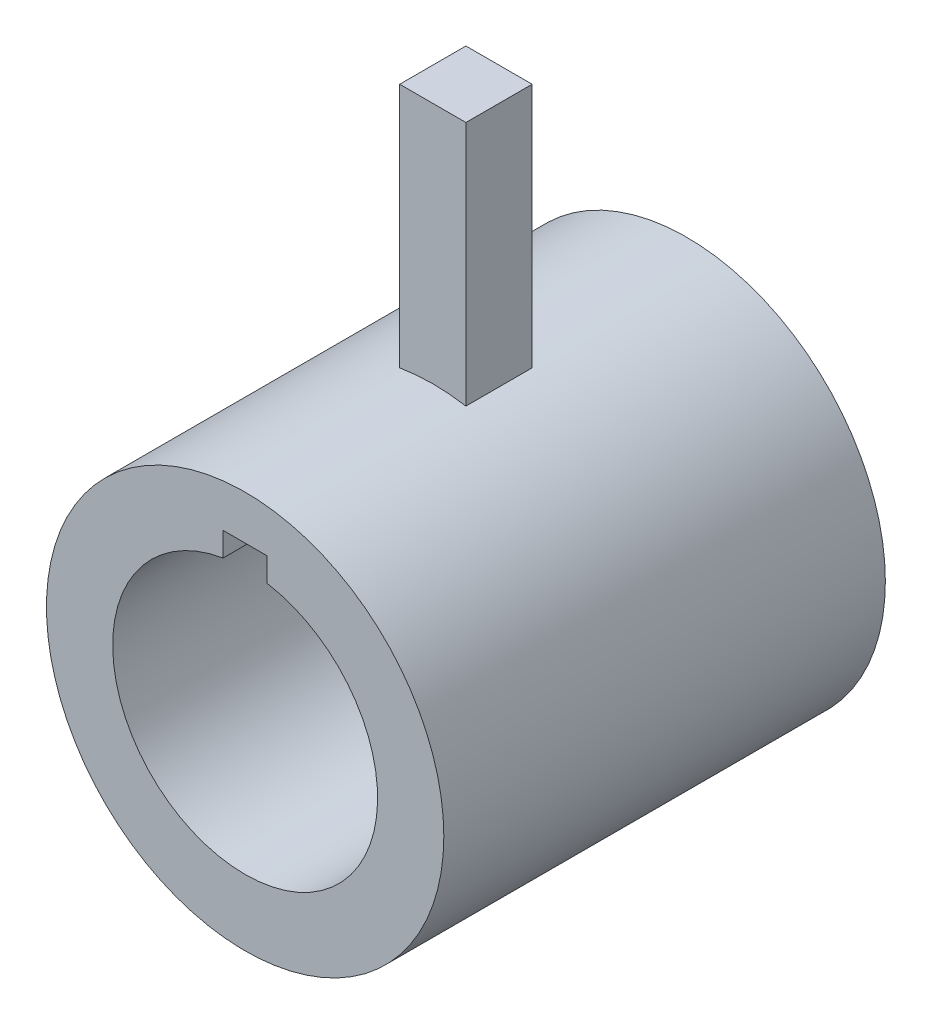
ISO-10303-21;
HEADER;
FILE_DESCRIPTION(('STEP AP214'),'2;1');
FILE_NAME('part.step','',(''),(''),'','','');
FILE_SCHEMA(('AUTOMOTIVE_DESIGN { 1 0 10303 214 1 1 1 1 }'));
ENDSEC;
DATA;
#1=APPLICATION_CONTEXT('core data for automotive mechanical design processes');
#2=APPLICATION_PROTOCOL_DEFINITION('international standard','automotive_design',2000,#1);
#3=PRODUCT_CONTEXT('',#1,'mechanical');
#4=PRODUCT('Part','Part','',(#3));
#5=PRODUCT_RELATED_PRODUCT_CATEGORY('part','',(#4));
#6=PRODUCT_DEFINITION_FORMATION('','',#4);
#7=PRODUCT_DEFINITION_CONTEXT('part definition',#1,'design');
#8=PRODUCT_DEFINITION('design','',#6,#7);
#9=PRODUCT_DEFINITION_SHAPE('','',#8);
#10=(LENGTH_UNIT() NAMED_UNIT(*) SI_UNIT(.MILLI.,.METRE.));
#11=(NAMED_UNIT(*) PLANE_ANGLE_UNIT() SI_UNIT($,.RADIAN.));
#12=(NAMED_UNIT(*) SI_UNIT($,.STERADIAN.) SOLID_ANGLE_UNIT());
#13=UNCERTAINTY_MEASURE_WITH_UNIT(LENGTH_MEASURE(1.E-05),#10,'distance_accuracy_value','');
#14=(GEOMETRIC_REPRESENTATION_CONTEXT(3) GLOBAL_UNCERTAINTY_ASSIGNED_CONTEXT((#13)) GLOBAL_UNIT_ASSIGNED_CONTEXT((#10,
#11,#12)) REPRESENTATION_CONTEXT('',''));
#15=CARTESIAN_POINT('',(0.,0.,0.));
#16=DIRECTION('',(0.,0.,1.));
#17=DIRECTION('',(1.,0.,0.));
#18=AXIS2_PLACEMENT_3D('',#15,#16,#17);
#19=CARTESIAN_POINT('',(0.,0.,10.));
#20=DIRECTION('',(0.,0.,-1.));
#21=DIRECTION('',(-1.,0.,0.));
#22=AXIS2_PLACEMENT_3D('',#19,#20,#21);
#23=CYLINDRICAL_SURFACE('',#22,4.5);
#24=CARTESIAN_POINT('',(0.,0.,0.));
#25=DIRECTION('',(0.,0.,1.));
#26=DIRECTION('',(1.,0.,0.));
#27=AXIS2_PLACEMENT_3D('',#24,#25,#26);
#28=CIRCLE('',#27,4.5);
#29=CARTESIAN_POINT('',(4.5,0.,0.));
#30=VERTEX_POINT('',#29);
#31=EDGE_CURVE('E160',#30,#30,#28,.T.);
#32=ORIENTED_EDGE('',*,*,#31,.T.);
#33=EDGE_LOOP('',(#32));
#34=FACE_BOUND('',#33,.T.);
#35=CARTESIAN_POINT('',(0.,0.,10.));
#36=DIRECTION('',(0.,0.,1.));
#37=DIRECTION('',(1.,0.,0.));
#38=AXIS2_PLACEMENT_3D('',#35,#36,#37);
#39=CIRCLE('',#38,4.5);
#40=CARTESIAN_POINT('',(4.5,0.,10.));
#41=VERTEX_POINT('',#40);
#42=EDGE_CURVE('E161',#41,#41,#39,.T.);
#43=ORIENTED_EDGE('',*,*,#42,.F.);
#44=EDGE_LOOP('',(#43));
#45=FACE_BOUND('',#44,.T.);
#46=DIRECTION('',(0.,0.,-1.));
#47=VECTOR('',#46,1.);
#48=CARTESIAN_POINT('',(0.750000000000001,4.43705983732471,10.));
#49=LINE('',#48,#47);
#50=CARTESIAN_POINT('',(0.750000000000001,4.43705983732471,5.75));
#51=VERTEX_POINT('',#50);
#52=CARTESIAN_POINT('',(0.750000000000001,4.43705983732471,4.25));
#53=VERTEX_POINT('',#52);
#54=EDGE_CURVE('E11',#51,#53,#49,.T.);
#55=ORIENTED_EDGE('',*,*,#54,.F.);
#56=CARTESIAN_POINT('',(0.,0.,5.75));
#57=DIRECTION('',(0.,0.,-1.));
#58=DIRECTION('',(-1.,0.,0.));
#59=AXIS2_PLACEMENT_3D('',#56,#57,#58);
#60=CIRCLE('',#59,4.5);
#61=CARTESIAN_POINT('',(-0.749999999999999,4.43705983732471,5.75));
#62=VERTEX_POINT('',#61);
#63=EDGE_CURVE('E164',#62,#51,#60,.T.);
#64=ORIENTED_EDGE('',*,*,#63,.F.);
#65=DIRECTION('',(0.,0.,-1.));
#66=VECTOR('',#65,1.);
#67=CARTESIAN_POINT('',(-0.749999999999999,4.43705983732471,10.));
#68=LINE('',#67,#66);
#69=CARTESIAN_POINT('',(-0.749999999999999,4.43705983732471,4.25));
#70=VERTEX_POINT('',#69);
#71=EDGE_CURVE('E60',#70,#62,#68,.F.);
#72=ORIENTED_EDGE('',*,*,#71,.F.);
#73=CARTESIAN_POINT('',(0.,0.,4.25));
#74=DIRECTION('',(0.,0.,1.));
#75=DIRECTION('',(1.,0.,0.));
#76=AXIS2_PLACEMENT_3D('',#73,#74,#75);
#77=CIRCLE('',#76,4.5);
#78=EDGE_CURVE('E50',#53,#70,#77,.T.);
#79=ORIENTED_EDGE('',*,*,#78,.F.);
#80=EDGE_LOOP('',(#55,#64,#72,#79));
#81=FACE_BOUND('',#80,.T.);
#82=ADVANCED_FACE('F43',(#34,#45,#81),#23,.T.);
#83=CARTESIAN_POINT('',(0.,0.,10.));
#84=DIRECTION('',(0.,0.,1.));
#85=DIRECTION('',(1.,0.,0.));
#86=AXIS2_PLACEMENT_3D('',#83,#84,#85);
#87=PLANE('',#86);
#88=ORIENTED_EDGE('',*,*,#42,.T.);
#89=EDGE_LOOP('',(#88));
#90=FACE_BOUND('',#89,.T.);
#91=DIRECTION('',(0.,1.,0.));
#92=VECTOR('',#91,1.);
#93=CARTESIAN_POINT('',(0.5,2.95803989154981,10.));
#94=LINE('',#93,#92);
#95=CARTESIAN_POINT('',(0.5,2.95803989154981,10.));
#96=VERTEX_POINT('',#95);
#97=CARTESIAN_POINT('',(0.5,3.5,10.));
#98=VERTEX_POINT('',#97);
#99=EDGE_CURVE('E135',#96,#98,#94,.T.);
#100=ORIENTED_EDGE('',*,*,#99,.F.);
#101=CARTESIAN_POINT('',(0.,0.,10.));
#102=DIRECTION('',(0.,0.,1.));
#103=DIRECTION('',(1.,0.,0.));
#104=AXIS2_PLACEMENT_3D('',#101,#102,#103);
#105=CIRCLE('',#104,3.);
#106=CARTESIAN_POINT('',(-0.5,2.95803989154981,10.));
#107=VERTEX_POINT('',#106);
#108=EDGE_CURVE('E133',#107,#96,#105,.T.);
#109=ORIENTED_EDGE('',*,*,#108,.F.);
#110=DIRECTION('',(0.,-1.,0.));
#111=VECTOR('',#110,1.);
#112=CARTESIAN_POINT('',(-0.5,2.95803989154981,10.));
#113=LINE('',#112,#111);
#114=CARTESIAN_POINT('',(-0.499999999999999,3.5,10.));
#115=VERTEX_POINT('',#114);
#116=EDGE_CURVE('E141',#115,#107,#113,.T.);
#117=ORIENTED_EDGE('',*,*,#116,.F.);
#118=DIRECTION('',(-1.,0.,0.));
#119=VECTOR('',#118,1.);
#120=CARTESIAN_POINT('',(0.5,3.5,10.));
#121=LINE('',#120,#119);
#122=EDGE_CURVE('E138',#98,#115,#121,.T.);
#123=ORIENTED_EDGE('',*,*,#122,.F.);
#124=EDGE_LOOP('',(#100,#109,#117,#123));
#125=FACE_BOUND('',#124,.T.);
#126=ADVANCED_FACE('F180',(#90,#125),#87,.T.);
#127=CARTESIAN_POINT('',(0.,0.,0.));
#128=DIRECTION('',(0.,0.,1.));
#129=DIRECTION('',(1.,0.,0.));
#130=AXIS2_PLACEMENT_3D('',#127,#128,#129);
#131=PLANE('',#130);
#132=ORIENTED_EDGE('',*,*,#31,.F.);
#133=EDGE_LOOP('',(#132));
#134=FACE_BOUND('',#133,.T.);
#135=CARTESIAN_POINT('',(0.,0.,0.));
#136=DIRECTION('',(0.,0.,1.));
#137=DIRECTION('',(1.,0.,0.));
#138=AXIS2_PLACEMENT_3D('',#135,#136,#137);
#139=CIRCLE('',#138,3.);
#140=CARTESIAN_POINT('',(-0.5,2.95803989154981,0.));
#141=VERTEX_POINT('',#140);
#142=CARTESIAN_POINT('',(0.5,2.95803989154981,0.));
#143=VERTEX_POINT('',#142);
#144=EDGE_CURVE('E124',#141,#143,#139,.T.);
#145=ORIENTED_EDGE('',*,*,#144,.T.);
#146=DIRECTION('',(0.,1.,0.));
#147=VECTOR('',#146,1.);
#148=CARTESIAN_POINT('',(0.5,2.95803989154981,0.));
#149=LINE('',#148,#147);
#150=CARTESIAN_POINT('',(0.5,3.5,0.));
#151=VERTEX_POINT('',#150);
#152=EDGE_CURVE('E127',#143,#151,#149,.T.);
#153=ORIENTED_EDGE('',*,*,#152,.T.);
#154=DIRECTION('',(-1.,0.,0.));
#155=VECTOR('',#154,1.);
#156=CARTESIAN_POINT('',(0.5,3.5,0.));
#157=LINE('',#156,#155);
#158=CARTESIAN_POINT('',(-0.499999999999999,3.5,0.));
#159=VERTEX_POINT('',#158);
#160=EDGE_CURVE('E146',#151,#159,#157,.T.);
#161=ORIENTED_EDGE('',*,*,#160,.T.);
#162=DIRECTION('',(0.,-1.,0.));
#163=VECTOR('',#162,1.);
#164=CARTESIAN_POINT('',(-0.5,2.95803989154981,0.));
#165=LINE('',#164,#163);
#166=EDGE_CURVE('E136',#159,#141,#165,.T.);
#167=ORIENTED_EDGE('',*,*,#166,.T.);
#168=EDGE_LOOP('',(#145,#153,#161,#167));
#169=FACE_BOUND('',#168,.T.);
#170=ADVANCED_FACE('F187',(#134,#169),#131,.F.);
#171=CARTESIAN_POINT('',(0.,0.,10.));
#172=DIRECTION('',(0.,0.,-1.));
#173=DIRECTION('',(-1.,0.,0.));
#174=AXIS2_PLACEMENT_3D('',#171,#172,#173);
#175=CYLINDRICAL_SURFACE('',#174,3.);
#176=ORIENTED_EDGE('',*,*,#144,.F.);
#177=DIRECTION('',(0.,0.,-1.));
#178=VECTOR('',#177,1.);
#179=CARTESIAN_POINT('',(-0.5,2.95803989154981,10.));
#180=LINE('',#179,#178);
#181=EDGE_CURVE('E142',#107,#141,#180,.T.);
#182=ORIENTED_EDGE('',*,*,#181,.F.);
#183=ORIENTED_EDGE('',*,*,#108,.T.);
#184=DIRECTION('',(0.,0.,-1.));
#185=VECTOR('',#184,1.);
#186=CARTESIAN_POINT('',(0.5,2.95803989154981,10.));
#187=LINE('',#186,#185);
#188=EDGE_CURVE('E157',#96,#143,#187,.T.);
#189=ORIENTED_EDGE('',*,*,#188,.T.);
#190=EDGE_LOOP('',(#176,#182,#183,#189));
#191=FACE_BOUND('',#190,.T.);
#192=ADVANCED_FACE('F208',(#191),#175,.F.);
#193=CARTESIAN_POINT('',(0.5,2.95803989154981,10.));
#194=DIRECTION('',(-1.,0.,0.));
#195=DIRECTION('',(0.,-1.,0.));
#196=AXIS2_PLACEMENT_3D('',#193,#194,#195);
#197=PLANE('',#196);
#198=ORIENTED_EDGE('',*,*,#152,.F.);
#199=ORIENTED_EDGE('',*,*,#188,.F.);
#200=ORIENTED_EDGE('',*,*,#99,.T.);
#201=DIRECTION('',(0.,0.,-1.));
#202=VECTOR('',#201,1.);
#203=CARTESIAN_POINT('',(0.5,3.5,10.));
#204=LINE('',#203,#202);
#205=EDGE_CURVE('E155',#98,#151,#204,.T.);
#206=ORIENTED_EDGE('',*,*,#205,.T.);
#207=EDGE_LOOP('',(#198,#199,#200,#206));
#208=FACE_BOUND('',#207,.T.);
#209=ADVANCED_FACE('F201',(#208),#197,.T.);
#210=CARTESIAN_POINT('',(0.5,3.5,10.));
#211=DIRECTION('',(0.,-1.,0.));
#212=DIRECTION('',(0.,0.,-1.));
#213=AXIS2_PLACEMENT_3D('',#210,#211,#212);
#214=PLANE('',#213);
#215=ORIENTED_EDGE('',*,*,#160,.F.);
#216=ORIENTED_EDGE('',*,*,#205,.F.);
#217=ORIENTED_EDGE('',*,*,#122,.T.);
#218=DIRECTION('',(0.,0.,-1.));
#219=VECTOR('',#218,1.);
#220=CARTESIAN_POINT('',(-0.499999999999999,3.5,10.));
#221=LINE('',#220,#219);
#222=EDGE_CURVE('E153',#115,#159,#221,.T.);
#223=ORIENTED_EDGE('',*,*,#222,.T.);
#224=EDGE_LOOP('',(#215,#216,#217,#223));
#225=FACE_BOUND('',#224,.T.);
#226=ADVANCED_FACE('F204',(#225),#214,.T.);
#227=CARTESIAN_POINT('',(-0.5,2.95803989154981,10.));
#228=DIRECTION('',(1.,0.,0.));
#229=DIRECTION('',(0.,1.,0.));
#230=AXIS2_PLACEMENT_3D('',#227,#228,#229);
#231=PLANE('',#230);
#232=ORIENTED_EDGE('',*,*,#166,.F.);
#233=ORIENTED_EDGE('',*,*,#222,.F.);
#234=ORIENTED_EDGE('',*,*,#116,.T.);
#235=ORIENTED_EDGE('',*,*,#181,.T.);
#236=EDGE_LOOP('',(#232,#233,#234,#235));
#237=FACE_BOUND('',#236,.T.);
#238=ADVANCED_FACE('F211',(#237),#231,.T.);
#239=CARTESIAN_POINT('',(0.750000000000001,10.,5.75));
#240=DIRECTION('',(-1.,0.,0.));
#241=DIRECTION('',(0.,0.,1.));
#242=AXIS2_PLACEMENT_3D('',#239,#240,#241);
#243=PLANE('',#242);
#244=DIRECTION('',(0.,-1.,0.));
#245=VECTOR('',#244,1.);
#246=CARTESIAN_POINT('',(0.750000000000001,10.,5.75));
#247=LINE('',#246,#245);
#248=CARTESIAN_POINT('',(0.750000000000001,10.,5.75));
#249=VERTEX_POINT('',#248);
#250=EDGE_CURVE('E174',#249,#51,#247,.T.);
#251=ORIENTED_EDGE('',*,*,#250,.T.);
#252=ORIENTED_EDGE('',*,*,#54,.T.);
#253=DIRECTION('',(0.,-1.,0.));
#254=VECTOR('',#253,1.);
#255=CARTESIAN_POINT('',(0.750000000000001,10.,4.25));
#256=LINE('',#255,#254);
#257=CARTESIAN_POINT('',(0.750000000000001,10.,4.25));
#258=VERTEX_POINT('',#257);
#259=EDGE_CURVE('E107',#258,#53,#256,.T.);
#260=ORIENTED_EDGE('',*,*,#259,.F.);
#261=DIRECTION('',(0.,0.,-1.));
#262=VECTOR('',#261,1.);
#263=CARTESIAN_POINT('',(0.750000000000001,10.,5.75));
#264=LINE('',#263,#262);
#265=EDGE_CURVE('E113',#249,#258,#264,.T.);
#266=ORIENTED_EDGE('',*,*,#265,.F.);
#267=EDGE_LOOP('',(#251,#252,#260,#266));
#268=FACE_BOUND('',#267,.T.);
#269=ADVANCED_FACE('F123',(#268),#243,.F.);
#270=CARTESIAN_POINT('',(-0.749999999999999,10.,5.75));
#271=DIRECTION('',(1.,0.,0.));
#272=DIRECTION('',(0.,0.,-1.));
#273=AXIS2_PLACEMENT_3D('',#270,#271,#272);
#274=PLANE('',#273);
#275=DIRECTION('',(0.,-1.,0.));
#276=VECTOR('',#275,1.);
#277=CARTESIAN_POINT('',(-0.749999999999999,10.,4.25));
#278=LINE('',#277,#276);
#279=CARTESIAN_POINT('',(-0.749999999999999,10.,4.25));
#280=VERTEX_POINT('',#279);
#281=EDGE_CURVE('E109',#280,#70,#278,.T.);
#282=ORIENTED_EDGE('',*,*,#281,.T.);
#283=ORIENTED_EDGE('',*,*,#71,.T.);
#284=DIRECTION('',(0.,-1.,0.));
#285=VECTOR('',#284,1.);
#286=CARTESIAN_POINT('',(-0.749999999999999,10.,5.75));
#287=LINE('',#286,#285);
#288=CARTESIAN_POINT('',(-0.749999999999999,10.,5.75));
#289=VERTEX_POINT('',#288);
#290=EDGE_CURVE('E129',#289,#62,#287,.T.);
#291=ORIENTED_EDGE('',*,*,#290,.F.);
#292=DIRECTION('',(0.,0.,1.));
#293=VECTOR('',#292,1.);
#294=CARTESIAN_POINT('',(-0.749999999999999,10.,5.75));
#295=LINE('',#294,#293);
#296=EDGE_CURVE('E112',#280,#289,#295,.T.);
#297=ORIENTED_EDGE('',*,*,#296,.F.);
#298=EDGE_LOOP('',(#282,#283,#291,#297));
#299=FACE_BOUND('',#298,.T.);
#300=ADVANCED_FACE('F170',(#299),#274,.F.);
#301=CARTESIAN_POINT('',(-0.749999999999999,10.,4.25));
#302=DIRECTION('',(0.,0.,1.));
#303=DIRECTION('',(1.,0.,0.));
#304=AXIS2_PLACEMENT_3D('',#301,#302,#303);
#305=PLANE('',#304);
#306=ORIENTED_EDGE('',*,*,#259,.T.);
#307=ORIENTED_EDGE('',*,*,#78,.T.);
#308=ORIENTED_EDGE('',*,*,#281,.F.);
#309=DIRECTION('',(-1.,0.,0.));
#310=VECTOR('',#309,1.);
#311=CARTESIAN_POINT('',(-0.749999999999999,10.,4.25));
#312=LINE('',#311,#310);
#313=EDGE_CURVE('E103',#258,#280,#312,.T.);
#314=ORIENTED_EDGE('',*,*,#313,.F.);
#315=EDGE_LOOP('',(#306,#307,#308,#314));
#316=FACE_BOUND('',#315,.T.);
#317=ADVANCED_FACE('F105',(#316),#305,.F.);
#318=CARTESIAN_POINT('',(-0.749999999999999,10.,5.75));
#319=DIRECTION('',(0.,0.,-1.));
#320=DIRECTION('',(-1.,0.,0.));
#321=AXIS2_PLACEMENT_3D('',#318,#319,#320);
#322=PLANE('',#321);
#323=ORIENTED_EDGE('',*,*,#290,.T.);
#324=ORIENTED_EDGE('',*,*,#63,.T.);
#325=ORIENTED_EDGE('',*,*,#250,.F.);
#326=DIRECTION('',(1.,0.,0.));
#327=VECTOR('',#326,1.);
#328=CARTESIAN_POINT('',(-0.749999999999999,10.,5.75));
#329=LINE('',#328,#327);
#330=EDGE_CURVE('E118',#289,#249,#329,.T.);
#331=ORIENTED_EDGE('',*,*,#330,.F.);
#332=EDGE_LOOP('',(#323,#324,#325,#331));
#333=FACE_BOUND('',#332,.T.);
#334=ADVANCED_FACE('F178',(#333),#322,.F.);
#335=CARTESIAN_POINT('',(0.,10.,0.));
#336=DIRECTION('',(0.,-1.,0.));
#337=DIRECTION('',(0.,0.,-1.));
#338=AXIS2_PLACEMENT_3D('',#335,#336,#337);
#339=PLANE('',#338);
#340=ORIENTED_EDGE('',*,*,#265,.T.);
#341=ORIENTED_EDGE('',*,*,#313,.T.);
#342=ORIENTED_EDGE('',*,*,#296,.T.);
#343=ORIENTED_EDGE('',*,*,#330,.T.);
#344=EDGE_LOOP('',(#340,#341,#342,#343));
#345=FACE_BOUND('',#344,.T.);
#346=ADVANCED_FACE('F116',(#345),#339,.F.);
#347=CLOSED_SHELL('',(#82,#126,#170,#192,#209,#226,#238,#269,#300,#317,#334,#346));
#348=MANIFOLD_SOLID_BREP('B2',#347);
#349=ADVANCED_BREP_SHAPE_REPRESENTATION('',(#18,#348),#14);
#350=SHAPE_DEFINITION_REPRESENTATION(#9,#349);
ENDSEC;
END-ISO-10303-21;
